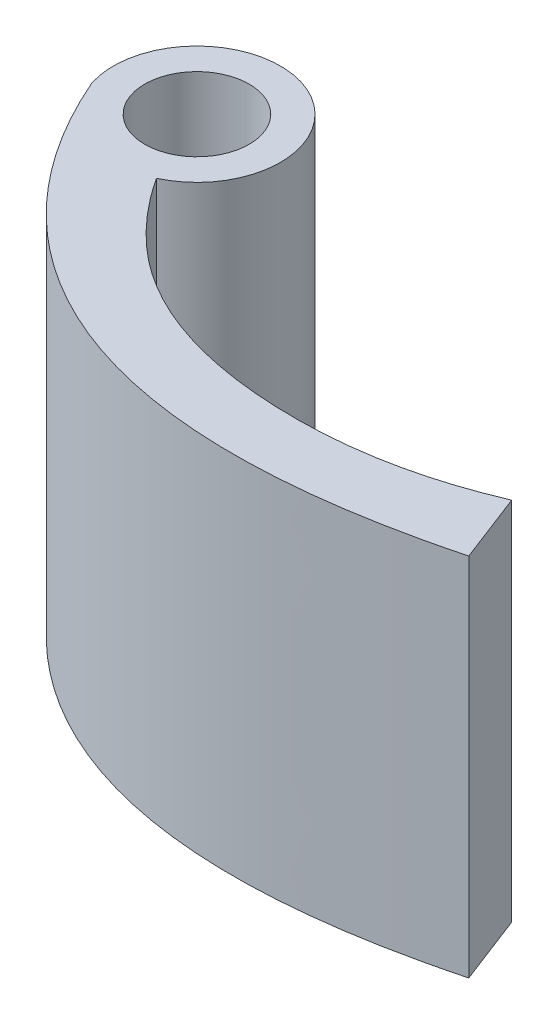
ISO-10303-21;
HEADER;
FILE_DESCRIPTION(('STEP AP214'),'2;1');
FILE_NAME('part.step','',(''),(''),'','','');
FILE_SCHEMA(('AUTOMOTIVE_DESIGN { 1 0 10303 214 1 1 1 1 }'));
ENDSEC;
DATA;
#1=APPLICATION_CONTEXT('core data for automotive mechanical design processes');
#2=APPLICATION_PROTOCOL_DEFINITION('international standard','automotive_design',2000,#1);
#3=PRODUCT_CONTEXT('',#1,'mechanical');
#4=PRODUCT('Part','Part','',(#3));
#5=PRODUCT_RELATED_PRODUCT_CATEGORY('part','',(#4));
#6=PRODUCT_DEFINITION_FORMATION('','',#4);
#7=PRODUCT_DEFINITION_CONTEXT('part definition',#1,'design');
#8=PRODUCT_DEFINITION('design','',#6,#7);
#9=PRODUCT_DEFINITION_SHAPE('','',#8);
#10=(LENGTH_UNIT() NAMED_UNIT(*) SI_UNIT(.MILLI.,.METRE.));
#11=(NAMED_UNIT(*) PLANE_ANGLE_UNIT() SI_UNIT($,.RADIAN.));
#12=(NAMED_UNIT(*) SI_UNIT($,.STERADIAN.) SOLID_ANGLE_UNIT());
#13=UNCERTAINTY_MEASURE_WITH_UNIT(LENGTH_MEASURE(1.E-05),#10,'distance_accuracy_value','');
#14=(GEOMETRIC_REPRESENTATION_CONTEXT(3) GLOBAL_UNCERTAINTY_ASSIGNED_CONTEXT((#13)) GLOBAL_UNIT_ASSIGNED_CONTEXT((#10,
#11,#12)) REPRESENTATION_CONTEXT('',''));
#15=CARTESIAN_POINT('',(0.,0.,0.));
#16=DIRECTION('',(0.,0.,1.));
#17=DIRECTION('',(1.,0.,0.));
#18=AXIS2_PLACEMENT_3D('',#15,#16,#17);
#19=CARTESIAN_POINT('',(10.5934418884606,17.5,9.81962069741123));
#20=DIRECTION('',(0.,-1.,0.));
#21=DIRECTION('',(0.,0.,-1.));
#22=AXIS2_PLACEMENT_3D('',#19,#20,#21);
#23=PLANE('',#22);
#24=CARTESIAN_POINT('',(23.5418795945372,17.5,8.46845520362058));
#25=CARTESIAN_POINT('',(19.0409249862092,17.5,10.4028454268517));
#26=CARTESIAN_POINT('',(7.80522684116914,17.5,10.0394228017009));
#27=CARTESIAN_POINT('',(2.72032425599838,17.5,5.2184871640726));
#28=CARTESIAN_POINT('',(1.68961459833319,17.5,3.62563132558998));
#29=B_SPLINE_CURVE_WITH_KNOTS('',2,(#24,#25,#26,#27,#28),.UNSPECIFIED.,.F.,.F.,(3,1,1,3),
(0.17505628759707,0.470264311615387,0.86018861941257,1.),.UNSPECIFIED.);
#30=CARTESIAN_POINT('',(23.5418795945372,17.5,8.46845520362058));
#31=VERTEX_POINT('',#30);
#32=CARTESIAN_POINT('',(1.68961459833319,17.5,3.62563132558998));
#33=VERTEX_POINT('',#32);
#34=EDGE_CURVE('E89',#31,#33,#29,.T.);
#35=ORIENTED_EDGE('',*,*,#34,.T.);
#36=CARTESIAN_POINT('',(0.,17.5,0.));
#37=DIRECTION('',(0.,1.,0.));
#38=DIRECTION('',(0.,0.,1.));
#39=AXIS2_PLACEMENT_3D('',#36,#37,#38);
#40=CIRCLE('',#39,4.);
#41=CARTESIAN_POINT('',(-3.80556884538777,17.5,1.23192766143714));
#42=VERTEX_POINT('',#41);
#43=EDGE_CURVE('E82',#33,#42,#40,.T.);
#44=ORIENTED_EDGE('',*,*,#43,.T.);
#45=CARTESIAN_POINT('',(-3.80556884538777,17.5,1.23192766143714));
#46=CARTESIAN_POINT('',(-3.52894661354001,17.5,1.86761472823672));
#47=CARTESIAN_POINT('',(-2.91873841885721,17.5,3.12557694757662));
#48=CARTESIAN_POINT('',(-1.51508795271248,17.5,5.45453998995459));
#49=CARTESIAN_POINT('',(0.623426846289678,17.5,8.04562159729289));
#50=CARTESIAN_POINT('',(3.78187340883226,17.5,10.4980157891063));
#51=CARTESIAN_POINT('',(7.4187297886314,17.5,12.1897286315684));
#52=CARTESIAN_POINT('',(11.3898374200088,17.5,13.110549791069));
#53=CARTESIAN_POINT('',(15.6095903802641,17.5,13.3267167549343));
#54=CARTESIAN_POINT('',(19.3307526186566,17.5,12.9773122994089));
#55=CARTESIAN_POINT('',(22.4195606686676,17.5,12.4100568526505));
#56=CARTESIAN_POINT('',(24.0386197891203,17.5,12.0237826284194));
#57=CARTESIAN_POINT('',(24.8316558001613,17.5,11.8149015748881));
#58=B_SPLINE_CURVE_WITH_KNOTS('',3,(#45,#46,#47,#48,#49,#50,#51,#52,#53,#54,#55,#56,#57),
.UNSPECIFIED.,.F.,.F.,(4,1,1,1,1,1,1,1,1,1,4),(0.,0.0625,0.125,0.25,0.375,0.5,0.625,0.75,0.875,
0.9375,1.),.UNSPECIFIED.);
#59=CARTESIAN_POINT('',(24.8316558001613,17.5,11.8149015748881));
#60=VERTEX_POINT('',#59);
#61=EDGE_CURVE('E86',#42,#60,#58,.T.);
#62=ORIENTED_EDGE('',*,*,#61,.T.);
#63=DIRECTION('',(-0.35963031457441,0.,-0.933094870224411));
#64=VECTOR('',#63,1.);
#65=CARTESIAN_POINT('',(23.5418795945372,17.5,8.46845520362058));
#66=LINE('',#65,#64);
#67=EDGE_CURVE('E54',#60,#31,#66,.T.);
#68=ORIENTED_EDGE('',*,*,#67,.T.);
#69=EDGE_LOOP('',(#35,#44,#62,#68));
#70=FACE_BOUND('',#69,.T.);
#71=CARTESIAN_POINT('',(0.,17.5,0.));
#72=DIRECTION('',(0.,1.,0.));
#73=DIRECTION('',(0.,0.,1.));
#74=AXIS2_PLACEMENT_3D('',#71,#72,#73);
#75=CIRCLE('',#74,2.5);
#76=CARTESIAN_POINT('',(0.,17.5,2.5));
#77=VERTEX_POINT('',#76);
#78=EDGE_CURVE('E131',#77,#77,#75,.T.);
#79=ORIENTED_EDGE('',*,*,#78,.F.);
#80=EDGE_LOOP('',(#79));
#81=FACE_BOUND('',#80,.T.);
#82=ADVANCED_FACE('F40',(#70,#81),#23,.F.);
#83=CARTESIAN_POINT('',(10.5934418884606,0.,9.81962069741123));
#84=DIRECTION('',(0.,-1.,0.));
#85=DIRECTION('',(0.,0.,-1.));
#86=AXIS2_PLACEMENT_3D('',#83,#84,#85);
#87=PLANE('',#86);
#88=CARTESIAN_POINT('',(23.5418795945372,0.,8.46845520362058));
#89=CARTESIAN_POINT('',(19.0409249862092,0.,10.4028454268517));
#90=CARTESIAN_POINT('',(7.80522684116914,0.,10.0394228017009));
#91=CARTESIAN_POINT('',(2.72032425599838,0.,5.2184871640726));
#92=CARTESIAN_POINT('',(1.68961459833319,0.,3.62563132558998));
#93=B_SPLINE_CURVE_WITH_KNOTS('',2,(#88,#89,#90,#91,#92),.UNSPECIFIED.,.F.,.F.,(3,1,1,3),
(0.17505628759707,0.470264311615387,0.86018861941257,1.),.UNSPECIFIED.);
#94=CARTESIAN_POINT('',(23.5418795945372,0.,8.46845520362058));
#95=VERTEX_POINT('',#94);
#96=CARTESIAN_POINT('',(1.68961459833319,0.,3.62563132558998));
#97=VERTEX_POINT('',#96);
#98=EDGE_CURVE('E137',#95,#97,#93,.T.);
#99=ORIENTED_EDGE('',*,*,#98,.F.);
#100=DIRECTION('',(-0.35963031457441,0.,-0.933094870224411));
#101=VECTOR('',#100,1.);
#102=CARTESIAN_POINT('',(23.5418795945372,0.,8.46845520362058));
#103=LINE('',#102,#101);
#104=CARTESIAN_POINT('',(24.8316558001613,0.,11.8149015748881));
#105=VERTEX_POINT('',#104);
#106=EDGE_CURVE('E79',#105,#95,#103,.T.);
#107=ORIENTED_EDGE('',*,*,#106,.F.);
#108=CARTESIAN_POINT('',(-3.80556884538777,0.,1.23192766143714));
#109=CARTESIAN_POINT('',(-3.52894661354001,0.,1.86761472823672));
#110=CARTESIAN_POINT('',(-2.91873841885721,0.,3.12557694757662));
#111=CARTESIAN_POINT('',(-1.51508795271248,0.,5.45453998995459));
#112=CARTESIAN_POINT('',(0.623426846289678,0.,8.04562159729289));
#113=CARTESIAN_POINT('',(3.78187340883226,0.,10.4980157891063));
#114=CARTESIAN_POINT('',(7.4187297886314,0.,12.1897286315684));
#115=CARTESIAN_POINT('',(11.3898374200088,0.,13.110549791069));
#116=CARTESIAN_POINT('',(15.6095903802641,0.,13.3267167549343));
#117=CARTESIAN_POINT('',(19.3307526186566,0.,12.9773122994089));
#118=CARTESIAN_POINT('',(22.4195606686676,0.,12.4100568526505));
#119=CARTESIAN_POINT('',(24.0386197891203,0.,12.0237826284194));
#120=CARTESIAN_POINT('',(24.8316558001613,0.,11.8149015748881));
#121=B_SPLINE_CURVE_WITH_KNOTS('',3,(#108,#109,#110,#111,#112,#113,#114,#115,#116,#117,#118,
#119,#120),.UNSPECIFIED.,.F.,.F.,(4,1,1,1,1,1,1,1,1,1,4),(0.,0.0625,0.125,0.25,0.375,0.5,0.625,
0.75,0.875,0.9375,1.),.UNSPECIFIED.);
#122=CARTESIAN_POINT('',(-3.80556884538777,0.,1.23192766143714));
#123=VERTEX_POINT('',#122);
#124=EDGE_CURVE('E75',#123,#105,#121,.T.);
#125=ORIENTED_EDGE('',*,*,#124,.F.);
#126=CARTESIAN_POINT('',(0.,0.,0.));
#127=DIRECTION('',(0.,1.,0.));
#128=DIRECTION('',(0.,0.,1.));
#129=AXIS2_PLACEMENT_3D('',#126,#127,#128);
#130=CIRCLE('',#129,4.);
#131=EDGE_CURVE('E94',#97,#123,#130,.T.);
#132=ORIENTED_EDGE('',*,*,#131,.F.);
#133=EDGE_LOOP('',(#99,#107,#125,#132));
#134=FACE_BOUND('',#133,.T.);
#135=CARTESIAN_POINT('',(0.,0.,0.));
#136=DIRECTION('',(0.,1.,0.));
#137=DIRECTION('',(0.,0.,1.));
#138=AXIS2_PLACEMENT_3D('',#135,#136,#137);
#139=CIRCLE('',#138,2.5);
#140=CARTESIAN_POINT('',(0.,0.,2.5));
#141=VERTEX_POINT('',#140);
#142=EDGE_CURVE('E136',#141,#141,#139,.T.);
#143=ORIENTED_EDGE('',*,*,#142,.T.);
#144=EDGE_LOOP('',(#143));
#145=FACE_BOUND('',#144,.T.);
#146=ADVANCED_FACE('F117',(#134,#145),#87,.T.);
#147=DIRECTION('',(0.,-1.,0.));
#148=VECTOR('',#147,1.);
#149=SURFACE_OF_LINEAR_EXTRUSION('',#29,#148);
#150=ORIENTED_EDGE('',*,*,#98,.T.);
#151=DIRECTION('',(0.,-1.,0.));
#152=VECTOR('',#151,1.);
#153=CARTESIAN_POINT('',(1.68961459833319,17.5,3.62563132558998));
#154=LINE('',#153,#152);
#155=EDGE_CURVE('E11',#33,#97,#154,.T.);
#156=ORIENTED_EDGE('',*,*,#155,.F.);
#157=ORIENTED_EDGE('',*,*,#34,.F.);
#158=DIRECTION('',(0.,-1.,0.));
#159=VECTOR('',#158,1.);
#160=CARTESIAN_POINT('',(23.5418795945372,17.5,8.46845520362058));
#161=LINE('',#160,#159);
#162=EDGE_CURVE('E98',#31,#95,#161,.T.);
#163=ORIENTED_EDGE('',*,*,#162,.T.);
#164=EDGE_LOOP('',(#150,#156,#157,#163));
#165=FACE_BOUND('',#164,.T.);
#166=ADVANCED_FACE('F39',(#165),#149,.F.);
#167=CARTESIAN_POINT('',(0.,17.5,0.));
#168=DIRECTION('',(0.,-1.,0.));
#169=DIRECTION('',(0.,0.,-1.));
#170=AXIS2_PLACEMENT_3D('',#167,#168,#169);
#171=CYLINDRICAL_SURFACE('',#170,4.);
#172=ORIENTED_EDGE('',*,*,#131,.T.);
#173=DIRECTION('',(0.,-1.,0.));
#174=VECTOR('',#173,1.);
#175=CARTESIAN_POINT('',(-3.80556884538777,17.5,1.23192766143714));
#176=LINE('',#175,#174);
#177=EDGE_CURVE('E50',#42,#123,#176,.T.);
#178=ORIENTED_EDGE('',*,*,#177,.F.);
#179=ORIENTED_EDGE('',*,*,#43,.F.);
#180=ORIENTED_EDGE('',*,*,#155,.T.);
#181=EDGE_LOOP('',(#172,#178,#179,#180));
#182=FACE_BOUND('',#181,.T.);
#183=ADVANCED_FACE('F91',(#182),#171,.T.);
#184=DIRECTION('',(0.,-1.,0.));
#185=VECTOR('',#184,1.);
#186=SURFACE_OF_LINEAR_EXTRUSION('',#58,#185);
#187=ORIENTED_EDGE('',*,*,#124,.T.);
#188=DIRECTION('',(0.,-1.,0.));
#189=VECTOR('',#188,1.);
#190=CARTESIAN_POINT('',(24.8316558001613,17.5,11.8149015748881));
#191=LINE('',#190,#189);
#192=EDGE_CURVE('E92',#60,#105,#191,.T.);
#193=ORIENTED_EDGE('',*,*,#192,.F.);
#194=ORIENTED_EDGE('',*,*,#61,.F.);
#195=ORIENTED_EDGE('',*,*,#177,.T.);
#196=EDGE_LOOP('',(#187,#193,#194,#195));
#197=FACE_BOUND('',#196,.T.);
#198=ADVANCED_FACE('F96',(#197),#186,.F.);
#199=CARTESIAN_POINT('',(23.5418795945372,17.5,8.46845520362058));
#200=DIRECTION('',(-0.933094870224411,0.,0.35963031457441));
#201=DIRECTION('',(0.35963031457441,0.,0.933094870224411));
#202=AXIS2_PLACEMENT_3D('',#199,#200,#201);
#203=PLANE('',#202);
#204=ORIENTED_EDGE('',*,*,#106,.T.);
#205=ORIENTED_EDGE('',*,*,#162,.F.);
#206=ORIENTED_EDGE('',*,*,#67,.F.);
#207=ORIENTED_EDGE('',*,*,#192,.T.);
#208=EDGE_LOOP('',(#204,#205,#206,#207));
#209=FACE_BOUND('',#208,.T.);
#210=ADVANCED_FACE('F109',(#209),#203,.F.);
#211=CARTESIAN_POINT('',(0.,17.5,0.));
#212=DIRECTION('',(0.,-1.,0.));
#213=DIRECTION('',(0.,0.,-1.));
#214=AXIS2_PLACEMENT_3D('',#211,#212,#213);
#215=CYLINDRICAL_SURFACE('',#214,2.5);
#216=ORIENTED_EDGE('',*,*,#78,.T.);
#217=EDGE_LOOP('',(#216));
#218=FACE_BOUND('',#217,.T.);
#219=ORIENTED_EDGE('',*,*,#142,.F.);
#220=EDGE_LOOP('',(#219));
#221=FACE_BOUND('',#220,.T.);
#222=ADVANCED_FACE('F122',(#218,#221),#215,.F.);
#223=CLOSED_SHELL('',(#82,#146,#166,#183,#198,#210,#222));
#224=MANIFOLD_SOLID_BREP('B2',#223);
#225=ADVANCED_BREP_SHAPE_REPRESENTATION('',(#18,#224),#14);
#226=SHAPE_DEFINITION_REPRESENTATION(#9,#225);
ENDSEC;
END-ISO-10303-21;
